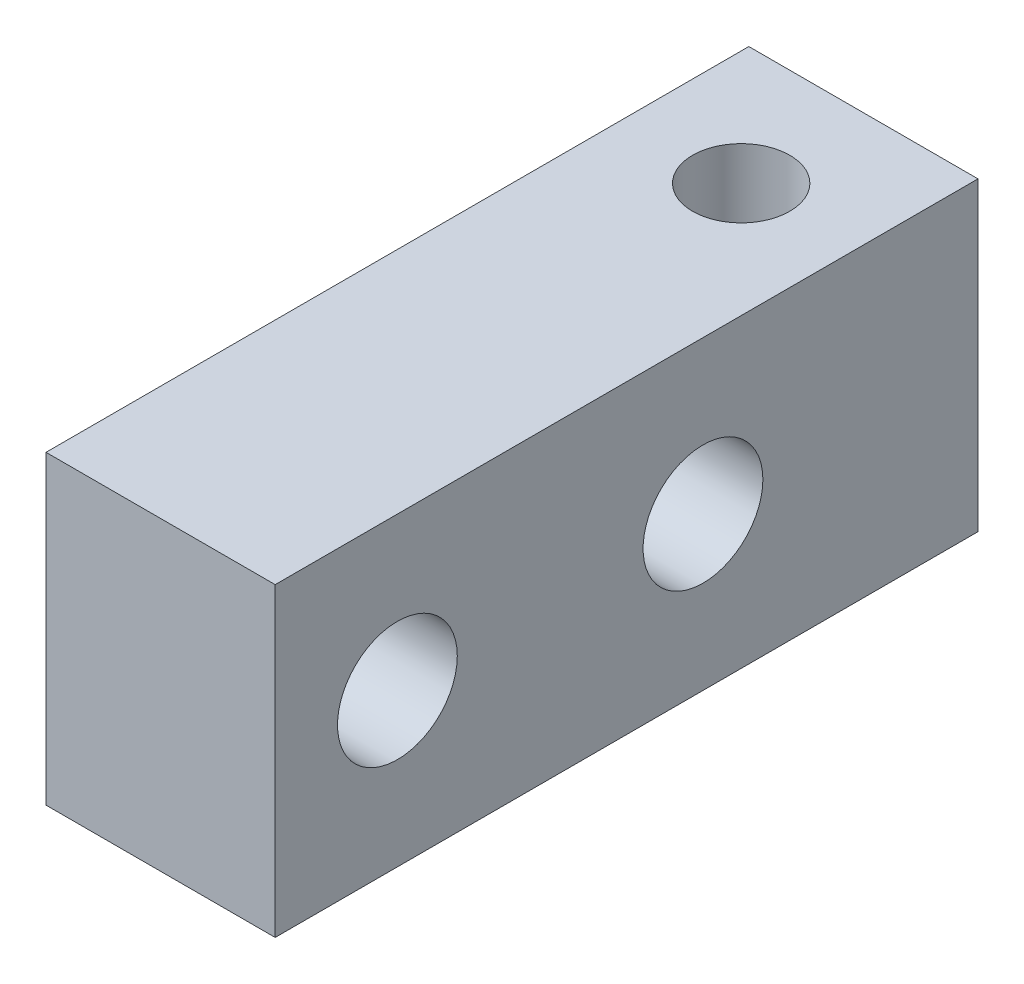
ISO-10303-21;
HEADER;
FILE_DESCRIPTION(('STEP AP214'),'2;1');
FILE_NAME('part.step','',(''),(''),'','','');
FILE_SCHEMA(('AUTOMOTIVE_DESIGN { 1 0 10303 214 1 1 1 1 }'));
ENDSEC;
DATA;
#1=APPLICATION_CONTEXT('core data for automotive mechanical design processes');
#2=APPLICATION_PROTOCOL_DEFINITION('international standard','automotive_design',2000,#1);
#3=PRODUCT_CONTEXT('',#1,'mechanical');
#4=PRODUCT('Part','Part','',(#3));
#5=PRODUCT_RELATED_PRODUCT_CATEGORY('part','',(#4));
#6=PRODUCT_DEFINITION_FORMATION('','',#4);
#7=PRODUCT_DEFINITION_CONTEXT('part definition',#1,'design');
#8=PRODUCT_DEFINITION('design','',#6,#7);
#9=PRODUCT_DEFINITION_SHAPE('','',#8);
#10=(LENGTH_UNIT() NAMED_UNIT(*) SI_UNIT(.MILLI.,.METRE.));
#11=(NAMED_UNIT(*) PLANE_ANGLE_UNIT() SI_UNIT($,.RADIAN.));
#12=(NAMED_UNIT(*) SI_UNIT($,.STERADIAN.) SOLID_ANGLE_UNIT());
#13=UNCERTAINTY_MEASURE_WITH_UNIT(LENGTH_MEASURE(1.E-05),#10,'distance_accuracy_value','');
#14=(GEOMETRIC_REPRESENTATION_CONTEXT(3) GLOBAL_UNCERTAINTY_ASSIGNED_CONTEXT((#13)) GLOBAL_UNIT_ASSIGNED_CONTEXT((#10,
#11,#12)) REPRESENTATION_CONTEXT('',''));
#15=CARTESIAN_POINT('',(0.,0.,0.));
#16=DIRECTION('',(0.,0.,1.));
#17=DIRECTION('',(1.,0.,0.));
#18=AXIS2_PLACEMENT_3D('',#15,#16,#17);
#19=CARTESIAN_POINT('',(4.7625,-6.35,-5.08));
#20=DIRECTION('',(0.,1.,0.));
#21=DIRECTION('',(0.,0.,1.));
#22=AXIS2_PLACEMENT_3D('',#19,#20,#21);
#23=PLANE('',#22);
#24=CARTESIAN_POINT('',(0.,-6.35000000000001,0.));
#25=DIRECTION('',(0.,1.,0.));
#26=DIRECTION('',(0.,0.,1.));
#27=AXIS2_PLACEMENT_3D('',#24,#25,#26);
#28=CIRCLE('',#27,2.0193);
#29=CARTESIAN_POINT('',(0.,-6.35000000000001,2.0193));
#30=VERTEX_POINT('',#29);
#31=EDGE_CURVE('E102',#30,#30,#28,.T.);
#32=ORIENTED_EDGE('',*,*,#31,.T.);
#33=EDGE_LOOP('',(#32));
#34=FACE_BOUND('',#33,.T.);
#35=DIRECTION('',(0.,0.,-1.));
#36=VECTOR('',#35,1.);
#37=CARTESIAN_POINT('',(-4.7625,-6.35,-5.08));
#38=LINE('',#37,#36);
#39=CARTESIAN_POINT('',(-4.7625,-6.35,24.13));
#40=VERTEX_POINT('',#39);
#41=CARTESIAN_POINT('',(-4.7625,-6.35,-5.08));
#42=VERTEX_POINT('',#41);
#43=EDGE_CURVE('E99',#40,#42,#38,.T.);
#44=ORIENTED_EDGE('',*,*,#43,.T.);
#45=DIRECTION('',(-1.,0.,0.));
#46=VECTOR('',#45,1.);
#47=CARTESIAN_POINT('',(4.7625,-6.35,-5.08));
#48=LINE('',#47,#46);
#49=CARTESIAN_POINT('',(4.7625,-6.35,-5.08));
#50=VERTEX_POINT('',#49);
#51=EDGE_CURVE('E11',#50,#42,#48,.T.);
#52=ORIENTED_EDGE('',*,*,#51,.F.);
#53=DIRECTION('',(0.,0.,-1.));
#54=VECTOR('',#53,1.);
#55=CARTESIAN_POINT('',(4.7625,-6.35,-5.08));
#56=LINE('',#55,#54);
#57=CARTESIAN_POINT('',(4.7625,-6.35,24.13));
#58=VERTEX_POINT('',#57);
#59=EDGE_CURVE('E87',#58,#50,#56,.T.);
#60=ORIENTED_EDGE('',*,*,#59,.F.);
#61=DIRECTION('',(-1.,0.,0.));
#62=VECTOR('',#61,1.);
#63=CARTESIAN_POINT('',(4.7625,-6.35,24.13));
#64=LINE('',#63,#62);
#65=EDGE_CURVE('E95',#58,#40,#64,.T.);
#66=ORIENTED_EDGE('',*,*,#65,.T.);
#67=EDGE_LOOP('',(#44,#52,#60,#66));
#68=FACE_BOUND('',#67,.T.);
#69=ADVANCED_FACE('F36',(#34,#68),#23,.F.);
#70=CARTESIAN_POINT('',(4.7625,-6.35,-5.08));
#71=DIRECTION('',(0.,0.,1.));
#72=DIRECTION('',(1.,0.,0.));
#73=AXIS2_PLACEMENT_3D('',#70,#71,#72);
#74=PLANE('',#73);
#75=DIRECTION('',(0.,1.,0.));
#76=VECTOR('',#75,1.);
#77=CARTESIAN_POINT('',(-4.7625,-6.35,-5.08));
#78=LINE('',#77,#76);
#79=CARTESIAN_POINT('',(-4.7625,6.35,-5.08));
#80=VERTEX_POINT('',#79);
#81=EDGE_CURVE('E91',#42,#80,#78,.T.);
#82=ORIENTED_EDGE('',*,*,#81,.T.);
#83=DIRECTION('',(-1.,0.,0.));
#84=VECTOR('',#83,1.);
#85=CARTESIAN_POINT('',(4.7625,6.35,-5.08));
#86=LINE('',#85,#84);
#87=CARTESIAN_POINT('',(4.7625,6.35,-5.08));
#88=VERTEX_POINT('',#87);
#89=EDGE_CURVE('E44',#88,#80,#86,.T.);
#90=ORIENTED_EDGE('',*,*,#89,.F.);
#91=DIRECTION('',(0.,1.,0.));
#92=VECTOR('',#91,1.);
#93=CARTESIAN_POINT('',(4.7625,-6.35,-5.08));
#94=LINE('',#93,#92);
#95=EDGE_CURVE('E82',#50,#88,#94,.T.);
#96=ORIENTED_EDGE('',*,*,#95,.F.);
#97=ORIENTED_EDGE('',*,*,#51,.T.);
#98=EDGE_LOOP('',(#82,#90,#96,#97));
#99=FACE_BOUND('',#98,.T.);
#100=ADVANCED_FACE('F90',(#99),#74,.F.);
#101=CARTESIAN_POINT('',(4.7625,6.35,-5.08));
#102=DIRECTION('',(0.,-1.,0.));
#103=DIRECTION('',(0.,0.,-1.));
#104=AXIS2_PLACEMENT_3D('',#101,#102,#103);
#105=PLANE('',#104);
#106=CARTESIAN_POINT('',(0.,6.35,0.));
#107=DIRECTION('',(0.,1.,0.));
#108=DIRECTION('',(0.,0.,1.));
#109=AXIS2_PLACEMENT_3D('',#106,#107,#108);
#110=CIRCLE('',#109,2.0193);
#111=CARTESIAN_POINT('',(0.,6.35,2.0193));
#112=VERTEX_POINT('',#111);
#113=EDGE_CURVE('E115',#112,#112,#110,.T.);
#114=ORIENTED_EDGE('',*,*,#113,.F.);
#115=EDGE_LOOP('',(#114));
#116=FACE_BOUND('',#115,.T.);
#117=DIRECTION('',(0.,0.,1.));
#118=VECTOR('',#117,1.);
#119=CARTESIAN_POINT('',(-4.7625,6.35,-5.08));
#120=LINE('',#119,#118);
#121=CARTESIAN_POINT('',(-4.7625,6.35,24.13));
#122=VERTEX_POINT('',#121);
#123=EDGE_CURVE('E69',#80,#122,#120,.T.);
#124=ORIENTED_EDGE('',*,*,#123,.T.);
#125=DIRECTION('',(-1.,0.,0.));
#126=VECTOR('',#125,1.);
#127=CARTESIAN_POINT('',(4.7625,6.35,24.13));
#128=LINE('',#127,#126);
#129=CARTESIAN_POINT('',(4.7625,6.35,24.13));
#130=VERTEX_POINT('',#129);
#131=EDGE_CURVE('E92',#130,#122,#128,.T.);
#132=ORIENTED_EDGE('',*,*,#131,.F.);
#133=DIRECTION('',(0.,0.,1.));
#134=VECTOR('',#133,1.);
#135=CARTESIAN_POINT('',(4.7625,6.35,-5.08));
#136=LINE('',#135,#134);
#137=EDGE_CURVE('E85',#88,#130,#136,.T.);
#138=ORIENTED_EDGE('',*,*,#137,.F.);
#139=ORIENTED_EDGE('',*,*,#89,.T.);
#140=EDGE_LOOP('',(#124,#132,#138,#139));
#141=FACE_BOUND('',#140,.T.);
#142=ADVANCED_FACE('F93',(#116,#141),#105,.F.);
#143=CARTESIAN_POINT('',(4.7625,-6.35,24.13));
#144=DIRECTION('',(0.,0.,-1.));
#145=DIRECTION('',(-1.,0.,0.));
#146=AXIS2_PLACEMENT_3D('',#143,#144,#145);
#147=PLANE('',#146);
#148=DIRECTION('',(0.,-1.,0.));
#149=VECTOR('',#148,1.);
#150=CARTESIAN_POINT('',(-4.7625,-6.35,24.13));
#151=LINE('',#150,#149);
#152=EDGE_CURVE('E75',#122,#40,#151,.T.);
#153=ORIENTED_EDGE('',*,*,#152,.T.);
#154=ORIENTED_EDGE('',*,*,#65,.F.);
#155=DIRECTION('',(0.,-1.,0.));
#156=VECTOR('',#155,1.);
#157=CARTESIAN_POINT('',(4.7625,-6.35,24.13));
#158=LINE('',#157,#156);
#159=EDGE_CURVE('E52',#130,#58,#158,.T.);
#160=ORIENTED_EDGE('',*,*,#159,.F.);
#161=ORIENTED_EDGE('',*,*,#131,.T.);
#162=EDGE_LOOP('',(#153,#154,#160,#161));
#163=FACE_BOUND('',#162,.T.);
#164=ADVANCED_FACE('F107',(#163),#147,.F.);
#165=CARTESIAN_POINT('',(4.7625,0.,0.));
#166=DIRECTION('',(-1.,0.,0.));
#167=DIRECTION('',(0.,0.,1.));
#168=AXIS2_PLACEMENT_3D('',#165,#166,#167);
#169=PLANE('',#168);
#170=CARTESIAN_POINT('',(4.7625,0.,6.35));
#171=DIRECTION('',(1.,0.,0.));
#172=DIRECTION('',(0.,0.,-1.));
#173=AXIS2_PLACEMENT_3D('',#170,#171,#172);
#174=CIRCLE('',#173,2.4892);
#175=CARTESIAN_POINT('',(4.7625,0.,3.8608));
#176=VERTEX_POINT('',#175);
#177=EDGE_CURVE('E127',#176,#176,#174,.T.);
#178=ORIENTED_EDGE('',*,*,#177,.F.);
#179=EDGE_LOOP('',(#178));
#180=FACE_BOUND('',#179,.T.);
#181=CARTESIAN_POINT('',(4.7625,0.,19.05));
#182=DIRECTION('',(1.,0.,0.));
#183=DIRECTION('',(0.,0.,-1.));
#184=AXIS2_PLACEMENT_3D('',#181,#182,#183);
#185=CIRCLE('',#184,2.4892);
#186=CARTESIAN_POINT('',(4.7625,0.,16.5608));
#187=VERTEX_POINT('',#186);
#188=EDGE_CURVE('E121',#187,#187,#185,.T.);
#189=ORIENTED_EDGE('',*,*,#188,.F.);
#190=EDGE_LOOP('',(#189));
#191=FACE_BOUND('',#190,.T.);
#192=ORIENTED_EDGE('',*,*,#59,.T.);
#193=ORIENTED_EDGE('',*,*,#95,.T.);
#194=ORIENTED_EDGE('',*,*,#137,.T.);
#195=ORIENTED_EDGE('',*,*,#159,.T.);
#196=EDGE_LOOP('',(#192,#193,#194,#195));
#197=FACE_BOUND('',#196,.T.);
#198=ADVANCED_FACE('F83',(#180,#191,#197),#169,.F.);
#199=CARTESIAN_POINT('',(-4.7625,0.,0.));
#200=DIRECTION('',(-1.,0.,0.));
#201=DIRECTION('',(0.,0.,1.));
#202=AXIS2_PLACEMENT_3D('',#199,#200,#201);
#203=PLANE('',#202);
#204=CARTESIAN_POINT('',(-4.7625,0.,6.35));
#205=DIRECTION('',(1.,0.,0.));
#206=DIRECTION('',(0.,0.,-1.));
#207=AXIS2_PLACEMENT_3D('',#204,#205,#206);
#208=CIRCLE('',#207,2.4892);
#209=CARTESIAN_POINT('',(-4.7625,0.,3.8608));
#210=VERTEX_POINT('',#209);
#211=EDGE_CURVE('E124',#210,#210,#208,.T.);
#212=ORIENTED_EDGE('',*,*,#211,.T.);
#213=EDGE_LOOP('',(#212));
#214=FACE_BOUND('',#213,.T.);
#215=CARTESIAN_POINT('',(-4.7625,0.,19.05));
#216=DIRECTION('',(1.,0.,0.));
#217=DIRECTION('',(0.,0.,-1.));
#218=AXIS2_PLACEMENT_3D('',#215,#216,#217);
#219=CIRCLE('',#218,2.4892);
#220=CARTESIAN_POINT('',(-4.7625,0.,16.5608));
#221=VERTEX_POINT('',#220);
#222=EDGE_CURVE('E118',#221,#221,#219,.T.);
#223=ORIENTED_EDGE('',*,*,#222,.T.);
#224=EDGE_LOOP('',(#223));
#225=FACE_BOUND('',#224,.T.);
#226=ORIENTED_EDGE('',*,*,#43,.F.);
#227=ORIENTED_EDGE('',*,*,#152,.F.);
#228=ORIENTED_EDGE('',*,*,#123,.F.);
#229=ORIENTED_EDGE('',*,*,#81,.F.);
#230=EDGE_LOOP('',(#226,#227,#228,#229));
#231=FACE_BOUND('',#230,.T.);
#232=ADVANCED_FACE('F110',(#214,#225,#231),#203,.T.);
#233=CARTESIAN_POINT('',(0.,6.35,0.));
#234=DIRECTION('',(0.,1.,0.));
#235=DIRECTION('',(0.,0.,1.));
#236=AXIS2_PLACEMENT_3D('',#233,#234,#235);
#237=CYLINDRICAL_SURFACE('',#236,2.0193);
#238=ORIENTED_EDGE('',*,*,#31,.F.);
#239=EDGE_LOOP('',(#238));
#240=FACE_BOUND('',#239,.T.);
#241=ORIENTED_EDGE('',*,*,#113,.T.);
#242=EDGE_LOOP('',(#241));
#243=FACE_BOUND('',#242,.T.);
#244=ADVANCED_FACE('F140',(#240,#243),#237,.F.);
#245=CARTESIAN_POINT('',(4.7625,0.,19.05));
#246=DIRECTION('',(1.,0.,0.));
#247=DIRECTION('',(0.,0.,-1.));
#248=AXIS2_PLACEMENT_3D('',#245,#246,#247);
#249=CYLINDRICAL_SURFACE('',#248,2.4892);
#250=ORIENTED_EDGE('',*,*,#222,.F.);
#251=EDGE_LOOP('',(#250));
#252=FACE_BOUND('',#251,.T.);
#253=ORIENTED_EDGE('',*,*,#188,.T.);
#254=EDGE_LOOP('',(#253));
#255=FACE_BOUND('',#254,.T.);
#256=ADVANCED_FACE('F138',(#252,#255),#249,.F.);
#257=CARTESIAN_POINT('',(4.7625,0.,6.35));
#258=DIRECTION('',(1.,0.,0.));
#259=DIRECTION('',(0.,0.,-1.));
#260=AXIS2_PLACEMENT_3D('',#257,#258,#259);
#261=CYLINDRICAL_SURFACE('',#260,2.4892);
#262=ORIENTED_EDGE('',*,*,#211,.F.);
#263=EDGE_LOOP('',(#262));
#264=FACE_BOUND('',#263,.T.);
#265=ORIENTED_EDGE('',*,*,#177,.T.);
#266=EDGE_LOOP('',(#265));
#267=FACE_BOUND('',#266,.T.);
#268=ADVANCED_FACE('F131',(#264,#267),#261,.F.);
#269=CLOSED_SHELL('',(#69,#100,#142,#164,#198,#232,#244,#256,#268));
#270=MANIFOLD_SOLID_BREP('B2',#269);
#271=ADVANCED_BREP_SHAPE_REPRESENTATION('',(#18,#270),#14);
#272=SHAPE_DEFINITION_REPRESENTATION(#9,#271);
ENDSEC;
END-ISO-10303-21;
